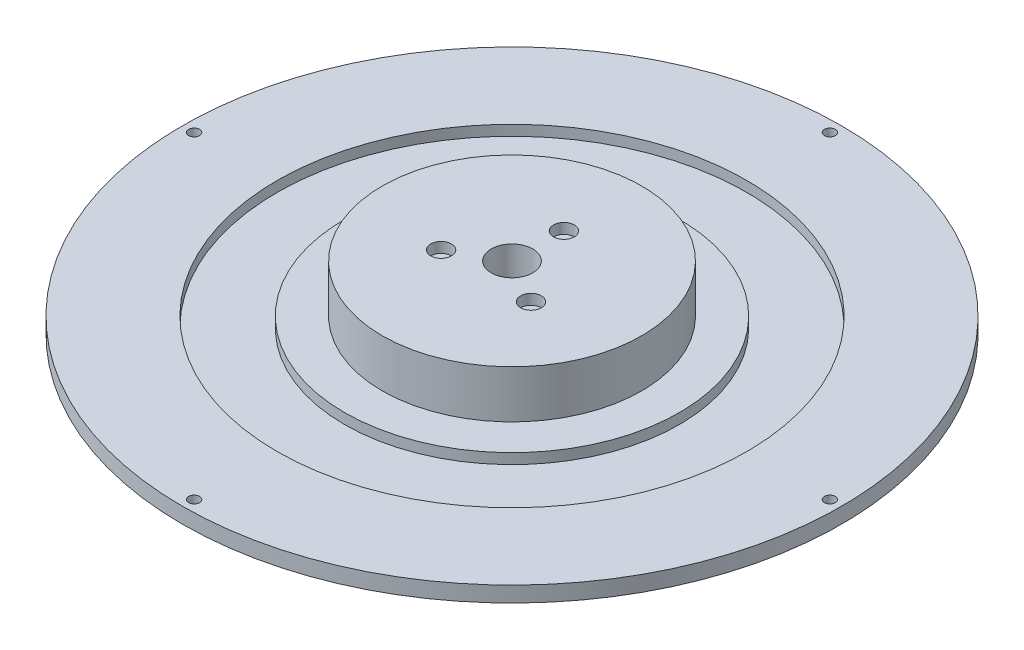
ISO-10303-21;
HEADER;
FILE_DESCRIPTION(('STEP AP214'),'2;1');
FILE_NAME('part.step','',(''),(''),'','','');
FILE_SCHEMA(('AUTOMOTIVE_DESIGN { 1 0 10303 214 1 1 1 1 }'));
ENDSEC;
DATA;
#1=APPLICATION_CONTEXT('core data for automotive mechanical design processes');
#2=APPLICATION_PROTOCOL_DEFINITION('international standard','automotive_design',2000,#1);
#3=PRODUCT_CONTEXT('',#1,'mechanical');
#4=PRODUCT('Part','Part','',(#3));
#5=PRODUCT_RELATED_PRODUCT_CATEGORY('part','',(#4));
#6=PRODUCT_DEFINITION_FORMATION('','',#4);
#7=PRODUCT_DEFINITION_CONTEXT('part definition',#1,'design');
#8=PRODUCT_DEFINITION('design','',#6,#7);
#9=PRODUCT_DEFINITION_SHAPE('','',#8);
#10=(LENGTH_UNIT() NAMED_UNIT(*) SI_UNIT(.MILLI.,.METRE.));
#11=(NAMED_UNIT(*) PLANE_ANGLE_UNIT() SI_UNIT($,.RADIAN.));
#12=(NAMED_UNIT(*) SI_UNIT($,.STERADIAN.) SOLID_ANGLE_UNIT());
#13=UNCERTAINTY_MEASURE_WITH_UNIT(LENGTH_MEASURE(1.E-05),#10,'distance_accuracy_value','');
#14=(GEOMETRIC_REPRESENTATION_CONTEXT(3) GLOBAL_UNCERTAINTY_ASSIGNED_CONTEXT((#13)) GLOBAL_UNIT_ASSIGNED_CONTEXT((#10,
#11,#12)) REPRESENTATION_CONTEXT('',''));
#15=CARTESIAN_POINT('',(0.,0.,0.));
#16=DIRECTION('',(0.,0.,1.));
#17=DIRECTION('',(1.,0.,0.));
#18=AXIS2_PLACEMENT_3D('',#15,#16,#17);
#19=CARTESIAN_POINT('',(0.,3.,0.));
#20=DIRECTION('',(0.,1.,0.));
#21=DIRECTION('',(0.,0.,1.));
#22=AXIS2_PLACEMENT_3D('',#19,#20,#21);
#23=PLANE('',#22);
#24=CARTESIAN_POINT('',(0.,3.,0.));
#25=DIRECTION('',(0.,1.,0.));
#26=DIRECTION('',(0.,0.,1.));
#27=AXIS2_PLACEMENT_3D('',#24,#25,#26);
#28=CIRCLE('',#27,45.25);
#29=CARTESIAN_POINT('',(0.,3.,45.25));
#30=VERTEX_POINT('',#29);
#31=EDGE_CURVE('E63',#30,#30,#28,.T.);
#32=ORIENTED_EDGE('',*,*,#31,.F.);
#33=EDGE_LOOP('',(#32));
#34=FACE_BOUND('',#33,.T.);
#35=CARTESIAN_POINT('',(-4.27706464008284E-13,3.,61.25));
#36=DIRECTION('',(0.,1.,0.));
#37=DIRECTION('',(0.,0.,1.));
#38=AXIS2_PLACEMENT_3D('',#35,#36,#37);
#39=CIRCLE('',#38,1.05);
#40=CARTESIAN_POINT('',(-4.27706464008284E-13,3.,62.3));
#41=VERTEX_POINT('',#40);
#42=EDGE_CURVE('E84',#41,#41,#39,.T.);
#43=ORIENTED_EDGE('',*,*,#42,.F.);
#44=EDGE_LOOP('',(#43));
#45=FACE_BOUND('',#44,.T.);
#46=CARTESIAN_POINT('',(0.,3.,-61.25));
#47=DIRECTION('',(0.,1.,0.));
#48=DIRECTION('',(0.,0.,1.));
#49=AXIS2_PLACEMENT_3D('',#46,#47,#48);
#50=CIRCLE('',#49,1.05);
#51=CARTESIAN_POINT('',(0.,3.,-60.2));
#52=VERTEX_POINT('',#51);
#53=EDGE_CURVE('E100',#52,#52,#50,.T.);
#54=ORIENTED_EDGE('',*,*,#53,.F.);
#55=EDGE_LOOP('',(#54));
#56=FACE_BOUND('',#55,.T.);
#57=CARTESIAN_POINT('',(0.,3.,0.));
#58=DIRECTION('',(0.,1.,0.));
#59=DIRECTION('',(0.,0.,1.));
#60=AXIS2_PLACEMENT_3D('',#57,#58,#59);
#61=CIRCLE('',#60,63.5);
#62=CARTESIAN_POINT('',(0.,3.,63.5));
#63=VERTEX_POINT('',#62);
#64=EDGE_CURVE('E49',#63,#63,#61,.T.);
#65=ORIENTED_EDGE('',*,*,#64,.T.);
#66=EDGE_LOOP('',(#65));
#67=FACE_BOUND('',#66,.T.);
#68=CARTESIAN_POINT('',(61.25,3.,2.13853232004142E-13));
#69=DIRECTION('',(0.,1.,0.));
#70=DIRECTION('',(0.,0.,1.));
#71=AXIS2_PLACEMENT_3D('',#68,#69,#70);
#72=CIRCLE('',#71,1.05);
#73=CARTESIAN_POINT('',(61.25,3.,1.05000000000021));
#74=VERTEX_POINT('',#73);
#75=EDGE_CURVE('E92',#74,#74,#72,.T.);
#76=ORIENTED_EDGE('',*,*,#75,.F.);
#77=EDGE_LOOP('',(#76));
#78=FACE_BOUND('',#77,.T.);
#79=CARTESIAN_POINT('',(-61.25,3.,-6.41559696012426E-13));
#80=DIRECTION('',(0.,1.,0.));
#81=DIRECTION('',(0.,0.,1.));
#82=AXIS2_PLACEMENT_3D('',#79,#80,#81);
#83=CIRCLE('',#82,1.05);
#84=CARTESIAN_POINT('',(-61.25,3.,1.04999999999936));
#85=VERTEX_POINT('',#84);
#86=EDGE_CURVE('E76',#85,#85,#83,.T.);
#87=ORIENTED_EDGE('',*,*,#86,.F.);
#88=EDGE_LOOP('',(#87));
#89=FACE_BOUND('',#88,.T.);
#90=ADVANCED_FACE('F40',(#34,#45,#56,#67,#78,#89),#23,.T.);
#91=CARTESIAN_POINT('',(0.,0.,0.));
#92=DIRECTION('',(0.,1.,0.));
#93=DIRECTION('',(0.,0.,1.));
#94=AXIS2_PLACEMENT_3D('',#91,#92,#93);
#95=PLANE('',#94);
#96=CARTESIAN_POINT('',(0.,0.,0.));
#97=DIRECTION('',(0.,1.,0.));
#98=DIRECTION('',(0.,0.,1.));
#99=AXIS2_PLACEMENT_3D('',#96,#97,#98);
#100=CIRCLE('',#99,4.);
#101=CARTESIAN_POINT('',(0.,0.,4.));
#102=VERTEX_POINT('',#101);
#103=EDGE_CURVE('E374',#102,#102,#100,.T.);
#104=ORIENTED_EDGE('',*,*,#103,.T.);
#105=EDGE_LOOP('',(#104));
#106=FACE_BOUND('',#105,.T.);
#107=CARTESIAN_POINT('',(0.,0.,0.));
#108=DIRECTION('',(0.,1.,0.));
#109=DIRECTION('',(0.,0.,1.));
#110=AXIS2_PLACEMENT_3D('',#107,#108,#109);
#111=CIRCLE('',#110,63.5);
#112=CARTESIAN_POINT('',(0.,0.,63.5));
#113=VERTEX_POINT('',#112);
#114=EDGE_CURVE('E44',#113,#113,#111,.T.);
#115=ORIENTED_EDGE('',*,*,#114,.F.);
#116=EDGE_LOOP('',(#115));
#117=FACE_BOUND('',#116,.T.);
#118=CARTESIAN_POINT('',(0.,0.,-61.25));
#119=DIRECTION('',(0.,1.,0.));
#120=DIRECTION('',(0.,0.,1.));
#121=AXIS2_PLACEMENT_3D('',#118,#119,#120);
#122=CIRCLE('',#121,1.05);
#123=CARTESIAN_POINT('',(0.,0.,-60.2));
#124=VERTEX_POINT('',#123);
#125=EDGE_CURVE('E96',#124,#124,#122,.T.);
#126=ORIENTED_EDGE('',*,*,#125,.T.);
#127=EDGE_LOOP('',(#126));
#128=FACE_BOUND('',#127,.T.);
#129=CARTESIAN_POINT('',(61.25,0.,2.13853232004142E-13));
#130=DIRECTION('',(0.,1.,0.));
#131=DIRECTION('',(0.,0.,1.));
#132=AXIS2_PLACEMENT_3D('',#129,#130,#131);
#133=CIRCLE('',#132,1.05);
#134=CARTESIAN_POINT('',(61.25,0.,1.05000000000021));
#135=VERTEX_POINT('',#134);
#136=EDGE_CURVE('E88',#135,#135,#133,.T.);
#137=ORIENTED_EDGE('',*,*,#136,.T.);
#138=EDGE_LOOP('',(#137));
#139=FACE_BOUND('',#138,.T.);
#140=CARTESIAN_POINT('',(-4.27706464008284E-13,0.,61.25));
#141=DIRECTION('',(0.,1.,0.));
#142=DIRECTION('',(0.,0.,1.));
#143=AXIS2_PLACEMENT_3D('',#140,#141,#142);
#144=CIRCLE('',#143,1.05);
#145=CARTESIAN_POINT('',(-4.27706464008284E-13,0.,62.3));
#146=VERTEX_POINT('',#145);
#147=EDGE_CURVE('E80',#146,#146,#144,.T.);
#148=ORIENTED_EDGE('',*,*,#147,.T.);
#149=EDGE_LOOP('',(#148));
#150=FACE_BOUND('',#149,.T.);
#151=CARTESIAN_POINT('',(-61.25,0.,-6.41559696012426E-13));
#152=DIRECTION('',(0.,1.,0.));
#153=DIRECTION('',(0.,0.,1.));
#154=AXIS2_PLACEMENT_3D('',#151,#152,#153);
#155=CIRCLE('',#154,1.05);
#156=CARTESIAN_POINT('',(-61.25,0.,1.04999999999936));
#157=VERTEX_POINT('',#156);
#158=EDGE_CURVE('E72',#157,#157,#155,.T.);
#159=ORIENTED_EDGE('',*,*,#158,.T.);
#160=EDGE_LOOP('',(#159));
#161=FACE_BOUND('',#160,.T.);
#162=ADVANCED_FACE('F108',(#106,#117,#128,#139,#150,#161),#95,.F.);
#163=CARTESIAN_POINT('',(0.,3.,0.));
#164=DIRECTION('',(0.,-1.,0.));
#165=DIRECTION('',(0.,0.,-1.));
#166=AXIS2_PLACEMENT_3D('',#163,#164,#165);
#167=CYLINDRICAL_SURFACE('',#166,63.5);
#168=ORIENTED_EDGE('',*,*,#64,.F.);
#169=EDGE_LOOP('',(#168));
#170=FACE_BOUND('',#169,.T.);
#171=ORIENTED_EDGE('',*,*,#114,.T.);
#172=EDGE_LOOP('',(#171));
#173=FACE_BOUND('',#172,.T.);
#174=ADVANCED_FACE('F42',(#170,#173),#167,.T.);
#175=CARTESIAN_POINT('',(0.,3.,-61.25));
#176=DIRECTION('',(0.,-1.,0.));
#177=DIRECTION('',(0.,0.,-1.));
#178=AXIS2_PLACEMENT_3D('',#175,#176,#177);
#179=CYLINDRICAL_SURFACE('',#178,1.05);
#180=ORIENTED_EDGE('',*,*,#53,.T.);
#181=EDGE_LOOP('',(#180));
#182=FACE_BOUND('',#181,.T.);
#183=ORIENTED_EDGE('',*,*,#125,.F.);
#184=EDGE_LOOP('',(#183));
#185=FACE_BOUND('',#184,.T.);
#186=ADVANCED_FACE('F111',(#182,#185),#179,.F.);
#187=CARTESIAN_POINT('',(61.25,3.,2.13853232004142E-13));
#188=DIRECTION('',(0.,-1.,0.));
#189=DIRECTION('',(0.,0.,-1.));
#190=AXIS2_PLACEMENT_3D('',#187,#188,#189);
#191=CYLINDRICAL_SURFACE('',#190,1.05);
#192=ORIENTED_EDGE('',*,*,#75,.T.);
#193=EDGE_LOOP('',(#192));
#194=FACE_BOUND('',#193,.T.);
#195=ORIENTED_EDGE('',*,*,#136,.F.);
#196=EDGE_LOOP('',(#195));
#197=FACE_BOUND('',#196,.T.);
#198=ADVANCED_FACE('F113',(#194,#197),#191,.F.);
#199=CARTESIAN_POINT('',(-4.27706464008284E-13,3.,61.25));
#200=DIRECTION('',(0.,-1.,0.));
#201=DIRECTION('',(0.,0.,-1.));
#202=AXIS2_PLACEMENT_3D('',#199,#200,#201);
#203=CYLINDRICAL_SURFACE('',#202,1.05);
#204=ORIENTED_EDGE('',*,*,#42,.T.);
#205=EDGE_LOOP('',(#204));
#206=FACE_BOUND('',#205,.T.);
#207=ORIENTED_EDGE('',*,*,#147,.F.);
#208=EDGE_LOOP('',(#207));
#209=FACE_BOUND('',#208,.T.);
#210=ADVANCED_FACE('F120',(#206,#209),#203,.F.);
#211=CARTESIAN_POINT('',(-61.25,3.,-6.41559696012426E-13));
#212=DIRECTION('',(0.,-1.,0.));
#213=DIRECTION('',(0.,0.,-1.));
#214=AXIS2_PLACEMENT_3D('',#211,#212,#213);
#215=CYLINDRICAL_SURFACE('',#214,1.05);
#216=ORIENTED_EDGE('',*,*,#86,.T.);
#217=EDGE_LOOP('',(#216));
#218=FACE_BOUND('',#217,.T.);
#219=ORIENTED_EDGE('',*,*,#158,.F.);
#220=EDGE_LOOP('',(#219));
#221=FACE_BOUND('',#220,.T.);
#222=ADVANCED_FACE('F164',(#218,#221),#215,.F.);
#223=CARTESIAN_POINT('',(0.,1.,0.));
#224=DIRECTION('',(0.,1.,0.));
#225=DIRECTION('',(0.,0.,1.));
#226=AXIS2_PLACEMENT_3D('',#223,#224,#225);
#227=CYLINDRICAL_SURFACE('',#226,45.25);
#228=CARTESIAN_POINT('',(0.,1.,0.));
#229=DIRECTION('',(0.,1.,0.));
#230=DIRECTION('',(0.,0.,1.));
#231=AXIS2_PLACEMENT_3D('',#228,#229,#230);
#232=CIRCLE('',#231,45.25);
#233=CARTESIAN_POINT('',(0.,1.,45.25));
#234=VERTEX_POINT('',#233);
#235=EDGE_CURVE('E68',#234,#234,#232,.T.);
#236=ORIENTED_EDGE('',*,*,#235,.F.);
#237=EDGE_LOOP('',(#236));
#238=FACE_BOUND('',#237,.T.);
#239=ORIENTED_EDGE('',*,*,#31,.T.);
#240=EDGE_LOOP('',(#239));
#241=FACE_BOUND('',#240,.T.);
#242=ADVANCED_FACE('F157',(#238,#241),#227,.F.);
#243=CARTESIAN_POINT('',(0.,1.,0.));
#244=DIRECTION('',(0.,1.,0.));
#245=DIRECTION('',(0.,0.,1.));
#246=AXIS2_PLACEMENT_3D('',#243,#244,#245);
#247=PLANE('',#246);
#248=CARTESIAN_POINT('',(0.,1.,0.));
#249=DIRECTION('',(0.,1.,0.));
#250=DIRECTION('',(0.,0.,1.));
#251=AXIS2_PLACEMENT_3D('',#248,#249,#250);
#252=CIRCLE('',#251,32.25);
#253=CARTESIAN_POINT('',(0.,1.,32.25));
#254=VERTEX_POINT('',#253);
#255=EDGE_CURVE('E59',#254,#254,#252,.T.);
#256=ORIENTED_EDGE('',*,*,#255,.F.);
#257=EDGE_LOOP('',(#256));
#258=FACE_BOUND('',#257,.T.);
#259=ORIENTED_EDGE('',*,*,#235,.T.);
#260=EDGE_LOOP('',(#259));
#261=FACE_BOUND('',#260,.T.);
#262=ADVANCED_FACE('F149',(#258,#261),#247,.T.);
#263=CARTESIAN_POINT('',(0.,1.,0.));
#264=DIRECTION('',(0.,1.,0.));
#265=DIRECTION('',(0.,0.,1.));
#266=AXIS2_PLACEMENT_3D('',#263,#264,#265);
#267=CYLINDRICAL_SURFACE('',#266,32.25);
#268=ORIENTED_EDGE('',*,*,#255,.T.);
#269=EDGE_LOOP('',(#268));
#270=FACE_BOUND('',#269,.T.);
#271=CARTESIAN_POINT('',(0.,3.,0.));
#272=DIRECTION('',(0.,1.,0.));
#273=DIRECTION('',(0.,0.,1.));
#274=AXIS2_PLACEMENT_3D('',#271,#272,#273);
#275=CIRCLE('',#274,32.25);
#276=CARTESIAN_POINT('',(0.,3.,32.25));
#277=VERTEX_POINT('',#276);
#278=EDGE_CURVE('E64',#277,#277,#275,.T.);
#279=ORIENTED_EDGE('',*,*,#278,.F.);
#280=EDGE_LOOP('',(#279));
#281=FACE_BOUND('',#280,.T.);
#282=ADVANCED_FACE('F138',(#270,#281),#267,.T.);
#283=CARTESIAN_POINT('',(0.,3.,0.));
#284=DIRECTION('',(0.,1.,0.));
#285=DIRECTION('',(0.,0.,1.));
#286=AXIS2_PLACEMENT_3D('',#283,#284,#285);
#287=CIRCLE('',#286,25.);
#288=CARTESIAN_POINT('',(0.,3.,25.));
#289=VERTEX_POINT('',#288);
#290=EDGE_CURVE('E10',#289,#289,#287,.T.);
#291=ORIENTED_EDGE('',*,*,#290,.F.);
#292=EDGE_LOOP('',(#291));
#293=FACE_BOUND('',#292,.T.);
#294=ORIENTED_EDGE('',*,*,#278,.T.);
#295=EDGE_LOOP('',(#294));
#296=FACE_BOUND('',#295,.T.);
#297=ADVANCED_FACE('F127',(#293,#296),#23,.T.);
#298=CARTESIAN_POINT('',(0.,12.2,0.));
#299=DIRECTION('',(0.,-1.,0.));
#300=DIRECTION('',(0.,0.,-1.));
#301=AXIS2_PLACEMENT_3D('',#298,#299,#300);
#302=CYLINDRICAL_SURFACE('',#301,25.);
#303=CARTESIAN_POINT('',(0.,12.2,0.));
#304=DIRECTION('',(0.,1.,0.));
#305=DIRECTION('',(0.,0.,1.));
#306=AXIS2_PLACEMENT_3D('',#303,#304,#305);
#307=CIRCLE('',#306,25.);
#308=CARTESIAN_POINT('',(0.,12.2,25.));
#309=VERTEX_POINT('',#308);
#310=EDGE_CURVE('E57',#309,#309,#307,.T.);
#311=ORIENTED_EDGE('',*,*,#310,.F.);
#312=EDGE_LOOP('',(#311));
#313=FACE_BOUND('',#312,.T.);
#314=ORIENTED_EDGE('',*,*,#290,.T.);
#315=EDGE_LOOP('',(#314));
#316=FACE_BOUND('',#315,.T.);
#317=ADVANCED_FACE('F137',(#313,#316),#302,.T.);
#318=CARTESIAN_POINT('',(0.,12.2,0.));
#319=DIRECTION('',(0.,1.,0.));
#320=DIRECTION('',(0.,0.,1.));
#321=AXIS2_PLACEMENT_3D('',#318,#319,#320);
#322=PLANE('',#321);
#323=CARTESIAN_POINT('',(0.,12.2,0.));
#324=DIRECTION('',(0.,1.,0.));
#325=DIRECTION('',(0.,0.,1.));
#326=AXIS2_PLACEMENT_3D('',#323,#324,#325);
#327=CIRCLE('',#326,4.);
#328=CARTESIAN_POINT('',(0.,12.2,4.));
#329=VERTEX_POINT('',#328);
#330=EDGE_CURVE('E377',#329,#329,#327,.T.);
#331=ORIENTED_EDGE('',*,*,#330,.F.);
#332=EDGE_LOOP('',(#331));
#333=FACE_BOUND('',#332,.T.);
#334=CARTESIAN_POINT('',(0.,12.2,-10.));
#335=DIRECTION('',(0.,1.,0.));
#336=DIRECTION('',(0.,0.,1.));
#337=AXIS2_PLACEMENT_3D('',#334,#335,#336);
#338=CIRCLE('',#337,2.);
#339=CARTESIAN_POINT('',(0.,12.2,-8.));
#340=VERTEX_POINT('',#339);
#341=EDGE_CURVE('E388',#340,#340,#338,.T.);
#342=ORIENTED_EDGE('',*,*,#341,.F.);
#343=EDGE_LOOP('',(#342));
#344=FACE_BOUND('',#343,.T.);
#345=CARTESIAN_POINT('',(8.66025403784437,12.2,5.00000000000004));
#346=DIRECTION('',(0.,1.,0.));
#347=DIRECTION('',(0.,0.,1.));
#348=AXIS2_PLACEMENT_3D('',#345,#346,#347);
#349=CIRCLE('',#348,2.);
#350=CARTESIAN_POINT('',(8.66025403784437,12.2,7.00000000000004));
#351=VERTEX_POINT('',#350);
#352=EDGE_CURVE('E392',#351,#351,#349,.T.);
#353=ORIENTED_EDGE('',*,*,#352,.F.);
#354=EDGE_LOOP('',(#353));
#355=FACE_BOUND('',#354,.T.);
#356=CARTESIAN_POINT('',(-8.66025403784443,12.2,4.99999999999992));
#357=DIRECTION('',(0.,1.,0.));
#358=DIRECTION('',(0.,0.,1.));
#359=AXIS2_PLACEMENT_3D('',#356,#357,#358);
#360=CIRCLE('',#359,2.);
#361=CARTESIAN_POINT('',(-8.66025403784443,12.2,6.99999999999992));
#362=VERTEX_POINT('',#361);
#363=EDGE_CURVE('E400',#362,#362,#360,.T.);
#364=ORIENTED_EDGE('',*,*,#363,.F.);
#365=EDGE_LOOP('',(#364));
#366=FACE_BOUND('',#365,.T.);
#367=ORIENTED_EDGE('',*,*,#310,.T.);
#368=EDGE_LOOP('',(#367));
#369=FACE_BOUND('',#368,.T.);
#370=ADVANCED_FACE('F145',(#333,#344,#355,#366,#369),#322,.T.);
#371=CARTESIAN_POINT('',(-8.66025403784443,10.2,4.99999999999992));
#372=DIRECTION('',(0.,1.,0.));
#373=DIRECTION('',(0.,0.,1.));
#374=AXIS2_PLACEMENT_3D('',#371,#372,#373);
#375=CYLINDRICAL_SURFACE('',#374,2.);
#376=CARTESIAN_POINT('',(-8.66025403784443,10.2,4.99999999999992));
#377=DIRECTION('',(0.,1.,0.));
#378=DIRECTION('',(0.,0.,1.));
#379=AXIS2_PLACEMENT_3D('',#376,#377,#378);
#380=CIRCLE('',#379,2.);
#381=CARTESIAN_POINT('',(-8.66025403784443,10.2,6.99999999999992));
#382=VERTEX_POINT('',#381);
#383=EDGE_CURVE('E381',#382,#382,#380,.T.);
#384=ORIENTED_EDGE('',*,*,#383,.F.);
#385=EDGE_LOOP('',(#384));
#386=FACE_BOUND('',#385,.T.);
#387=ORIENTED_EDGE('',*,*,#363,.T.);
#388=EDGE_LOOP('',(#387));
#389=FACE_BOUND('',#388,.T.);
#390=ADVANCED_FACE('F237',(#386,#389),#375,.F.);
#391=CARTESIAN_POINT('',(-8.66025403784443,10.2,4.99999999999992));
#392=DIRECTION('',(0.,1.,0.));
#393=DIRECTION('',(0.,0.,1.));
#394=AXIS2_PLACEMENT_3D('',#391,#392,#393);
#395=PLANE('',#394);
#396=ORIENTED_EDGE('',*,*,#383,.T.);
#397=EDGE_LOOP('',(#396));
#398=FACE_BOUND('',#397,.T.);
#399=ADVANCED_FACE('F246',(#398),#395,.T.);
#400=CARTESIAN_POINT('',(8.66025403784437,10.2,5.00000000000004));
#401=DIRECTION('',(0.,1.,0.));
#402=DIRECTION('',(0.,0.,1.));
#403=AXIS2_PLACEMENT_3D('',#400,#401,#402);
#404=CYLINDRICAL_SURFACE('',#403,2.);
#405=CARTESIAN_POINT('',(8.66025403784437,10.2,5.00000000000004));
#406=DIRECTION('',(0.,1.,0.));
#407=DIRECTION('',(0.,0.,1.));
#408=AXIS2_PLACEMENT_3D('',#405,#406,#407);
#409=CIRCLE('',#408,2.);
#410=CARTESIAN_POINT('',(8.66025403784437,10.2,7.00000000000004));
#411=VERTEX_POINT('',#410);
#412=EDGE_CURVE('E396',#411,#411,#409,.T.);
#413=ORIENTED_EDGE('',*,*,#412,.F.);
#414=EDGE_LOOP('',(#413));
#415=FACE_BOUND('',#414,.T.);
#416=ORIENTED_EDGE('',*,*,#352,.T.);
#417=EDGE_LOOP('',(#416));
#418=FACE_BOUND('',#417,.T.);
#419=ADVANCED_FACE('F257',(#415,#418),#404,.F.);
#420=CARTESIAN_POINT('',(8.66025403784437,10.2,5.00000000000004));
#421=DIRECTION('',(0.,1.,0.));
#422=DIRECTION('',(0.,0.,1.));
#423=AXIS2_PLACEMENT_3D('',#420,#421,#422);
#424=PLANE('',#423);
#425=ORIENTED_EDGE('',*,*,#412,.T.);
#426=EDGE_LOOP('',(#425));
#427=FACE_BOUND('',#426,.T.);
#428=ADVANCED_FACE('F268',(#427),#424,.T.);
#429=CARTESIAN_POINT('',(0.,10.2,-10.));
#430=DIRECTION('',(0.,1.,0.));
#431=DIRECTION('',(0.,0.,1.));
#432=AXIS2_PLACEMENT_3D('',#429,#430,#431);
#433=CYLINDRICAL_SURFACE('',#432,2.);
#434=CARTESIAN_POINT('',(0.,10.2,-10.));
#435=DIRECTION('',(0.,1.,0.));
#436=DIRECTION('',(0.,0.,1.));
#437=AXIS2_PLACEMENT_3D('',#434,#435,#436);
#438=CIRCLE('',#437,2.);
#439=CARTESIAN_POINT('',(0.,10.2,-8.));
#440=VERTEX_POINT('',#439);
#441=EDGE_CURVE('E384',#440,#440,#438,.T.);
#442=ORIENTED_EDGE('',*,*,#441,.F.);
#443=EDGE_LOOP('',(#442));
#444=FACE_BOUND('',#443,.T.);
#445=ORIENTED_EDGE('',*,*,#341,.T.);
#446=EDGE_LOOP('',(#445));
#447=FACE_BOUND('',#446,.T.);
#448=ADVANCED_FACE('F279',(#444,#447),#433,.F.);
#449=CARTESIAN_POINT('',(0.,10.2,-10.));
#450=DIRECTION('',(0.,1.,0.));
#451=DIRECTION('',(0.,0.,1.));
#452=AXIS2_PLACEMENT_3D('',#449,#450,#451);
#453=PLANE('',#452);
#454=ORIENTED_EDGE('',*,*,#441,.T.);
#455=EDGE_LOOP('',(#454));
#456=FACE_BOUND('',#455,.T.);
#457=ADVANCED_FACE('F290',(#456),#453,.T.);
#458=CARTESIAN_POINT('',(0.,0.,0.));
#459=DIRECTION('',(0.,1.,0.));
#460=DIRECTION('',(0.,0.,1.));
#461=AXIS2_PLACEMENT_3D('',#458,#459,#460);
#462=CYLINDRICAL_SURFACE('',#461,4.);
#463=ORIENTED_EDGE('',*,*,#103,.F.);
#464=EDGE_LOOP('',(#463));
#465=FACE_BOUND('',#464,.T.);
#466=ORIENTED_EDGE('',*,*,#330,.T.);
#467=EDGE_LOOP('',(#466));
#468=FACE_BOUND('',#467,.T.);
#469=ADVANCED_FACE('F301',(#465,#468),#462,.F.);
#470=CLOSED_SHELL('',(#90,#162,#174,#186,#198,#210,#222,#242,#262,#282,#297,#317,#370,#390,#399,
#419,#428,#448,#457,#469));
#471=MANIFOLD_SOLID_BREP('B2',#470);
#472=ADVANCED_BREP_SHAPE_REPRESENTATION('',(#18,#471),#14);
#473=SHAPE_DEFINITION_REPRESENTATION(#9,#472);
ENDSEC;
END-ISO-10303-21;
